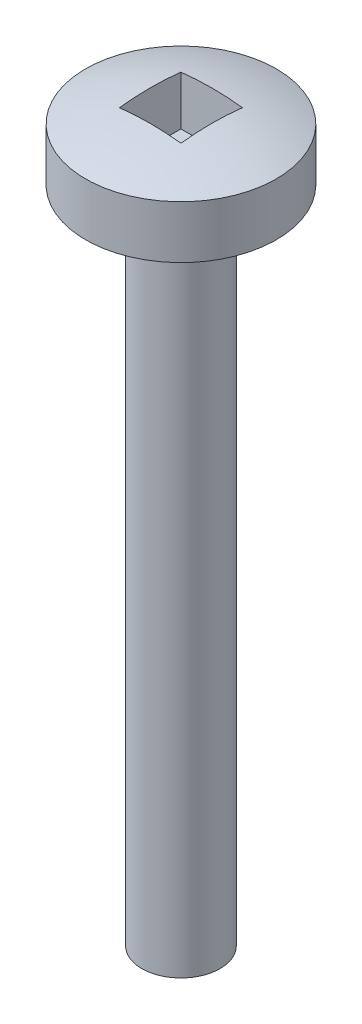
ISO-10303-21;
HEADER;
FILE_DESCRIPTION(('STEP AP214'),'2;1');
FILE_NAME('part.step','',(''),(''),'','','');
FILE_SCHEMA(('AUTOMOTIVE_DESIGN { 1 0 10303 214 1 1 1 1 }'));
ENDSEC;
DATA;
#1=APPLICATION_CONTEXT('core data for automotive mechanical design processes');
#2=APPLICATION_PROTOCOL_DEFINITION('international standard','automotive_design',2000,#1);
#3=PRODUCT_CONTEXT('',#1,'mechanical');
#4=PRODUCT('Part','Part','',(#3));
#5=PRODUCT_RELATED_PRODUCT_CATEGORY('part','',(#4));
#6=PRODUCT_DEFINITION_FORMATION('','',#4);
#7=PRODUCT_DEFINITION_CONTEXT('part definition',#1,'design');
#8=PRODUCT_DEFINITION('design','',#6,#7);
#9=PRODUCT_DEFINITION_SHAPE('','',#8);
#10=(LENGTH_UNIT() NAMED_UNIT(*) SI_UNIT(.MILLI.,.METRE.));
#11=(NAMED_UNIT(*) PLANE_ANGLE_UNIT() SI_UNIT($,.RADIAN.));
#12=(NAMED_UNIT(*) SI_UNIT($,.STERADIAN.) SOLID_ANGLE_UNIT());
#13=UNCERTAINTY_MEASURE_WITH_UNIT(LENGTH_MEASURE(1.E-05),#10,'distance_accuracy_value','');
#14=(GEOMETRIC_REPRESENTATION_CONTEXT(3) GLOBAL_UNCERTAINTY_ASSIGNED_CONTEXT((#13)) GLOBAL_UNIT_ASSIGNED_CONTEXT((#10,
#11,#12)) REPRESENTATION_CONTEXT('',''));
#15=CARTESIAN_POINT('',(0.,0.,0.));
#16=DIRECTION('',(0.,0.,1.));
#17=DIRECTION('',(1.,0.,0.));
#18=AXIS2_PLACEMENT_3D('',#15,#16,#17);
#19=CARTESIAN_POINT('',(0.,-19.05,0.));
#20=DIRECTION('',(0.,1.,0.));
#21=DIRECTION('',(0.,0.,1.));
#22=AXIS2_PLACEMENT_3D('',#19,#20,#21);
#23=CYLINDRICAL_SURFACE('',#22,1.1303);
#24=CARTESIAN_POINT('',(0.,-19.05,0.));
#25=DIRECTION('',(0.,1.,0.));
#26=DIRECTION('',(0.,0.,1.));
#27=AXIS2_PLACEMENT_3D('',#24,#25,#26);
#28=CIRCLE('',#27,1.1303);
#29=CARTESIAN_POINT('',(0.,-19.05,1.1303));
#30=VERTEX_POINT('',#29);
#31=EDGE_CURVE('E105',#30,#30,#28,.T.);
#32=CARTESIAN_POINT('',(0.,0.,0.));
#33=DIRECTION('',(0.,1.,0.));
#34=DIRECTION('',(0.,0.,1.));
#35=AXIS2_PLACEMENT_3D('',#32,#33,#34);
#36=CIRCLE('',#35,1.1303);
#37=CARTESIAN_POINT('',(0.,0.,1.1303));
#38=VERTEX_POINT('',#37);
#39=EDGE_CURVE('E109',#38,#38,#36,.T.);
#40=CARTESIAN_POINT('',(0.,-19.05,1.1303));
#41=CARTESIAN_POINT('',(0.,-18.8515625,1.1303));
#42=CARTESIAN_POINT('',(0.,-18.653125,1.1303));
#43=CARTESIAN_POINT('',(0.,-18.25625,1.1303));
#44=CARTESIAN_POINT('',(0.,-18.0578125,1.1303));
#45=CARTESIAN_POINT('',(0.,-17.6609375,1.1303));
#46=CARTESIAN_POINT('',(0.,-17.4625,1.1303));
#47=CARTESIAN_POINT('',(0.,-17.065625,1.1303));
#48=CARTESIAN_POINT('',(0.,-16.8671875,1.1303));
#49=CARTESIAN_POINT('',(0.,-16.4703125,1.1303));
#50=CARTESIAN_POINT('',(0.,-16.271875,1.1303));
#51=CARTESIAN_POINT('',(0.,-15.875,1.1303));
#52=CARTESIAN_POINT('',(0.,-15.6765625,1.1303));
#53=CARTESIAN_POINT('',(0.,-15.2796875,1.1303));
#54=CARTESIAN_POINT('',(0.,-15.08125,1.1303));
#55=CARTESIAN_POINT('',(0.,-14.684375,1.1303));
#56=CARTESIAN_POINT('',(0.,-14.4859375,1.1303));
#57=CARTESIAN_POINT('',(0.,-14.0890625,1.1303));
#58=CARTESIAN_POINT('',(0.,-13.890625,1.1303));
#59=CARTESIAN_POINT('',(0.,-13.49375,1.1303));
#60=CARTESIAN_POINT('',(0.,-13.2953125,1.1303));
#61=CARTESIAN_POINT('',(0.,-12.8984375,1.1303));
#62=CARTESIAN_POINT('',(0.,-12.7,1.1303));
#63=CARTESIAN_POINT('',(0.,-12.303125,1.1303));
#64=CARTESIAN_POINT('',(0.,-12.1046875,1.1303));
#65=CARTESIAN_POINT('',(0.,-11.7078125,1.1303));
#66=CARTESIAN_POINT('',(0.,-11.509375,1.1303));
#67=CARTESIAN_POINT('',(0.,-11.1125,1.1303));
#68=CARTESIAN_POINT('',(0.,-10.9140625,1.1303));
#69=CARTESIAN_POINT('',(0.,-10.5171875,1.1303));
#70=CARTESIAN_POINT('',(0.,-10.31875,1.1303));
#71=CARTESIAN_POINT('',(0.,-9.921875,1.1303));
#72=CARTESIAN_POINT('',(0.,-9.7234375,1.1303));
#73=CARTESIAN_POINT('',(0.,-9.3265625,1.1303));
#74=CARTESIAN_POINT('',(0.,-9.128125,1.1303));
#75=CARTESIAN_POINT('',(0.,-8.73125,1.1303));
#76=CARTESIAN_POINT('',(0.,-8.5328125,1.1303));
#77=CARTESIAN_POINT('',(0.,-8.1359375,1.1303));
#78=CARTESIAN_POINT('',(0.,-7.9375,1.1303));
#79=CARTESIAN_POINT('',(0.,-7.540625,1.1303));
#80=CARTESIAN_POINT('',(0.,-7.3421875,1.1303));
#81=CARTESIAN_POINT('',(0.,-6.9453125,1.1303));
#82=CARTESIAN_POINT('',(0.,-6.746875,1.1303));
#83=CARTESIAN_POINT('',(0.,-6.35,1.1303));
#84=CARTESIAN_POINT('',(0.,-6.1515625,1.1303));
#85=CARTESIAN_POINT('',(0.,-5.7546875,1.1303));
#86=CARTESIAN_POINT('',(0.,-5.55625,1.1303));
#87=CARTESIAN_POINT('',(0.,-5.159375,1.1303));
#88=CARTESIAN_POINT('',(0.,-4.9609375,1.1303));
#89=CARTESIAN_POINT('',(0.,-4.5640625,1.1303));
#90=CARTESIAN_POINT('',(0.,-4.365625,1.1303));
#91=CARTESIAN_POINT('',(0.,-3.96875,1.1303));
#92=CARTESIAN_POINT('',(0.,-3.7703125,1.1303));
#93=CARTESIAN_POINT('',(0.,-3.3734375,1.1303));
#94=CARTESIAN_POINT('',(0.,-3.175,1.1303));
#95=CARTESIAN_POINT('',(0.,-2.778125,1.1303));
#96=CARTESIAN_POINT('',(0.,-2.5796875,1.1303));
#97=CARTESIAN_POINT('',(0.,-2.1828125,1.1303));
#98=CARTESIAN_POINT('',(0.,-1.984375,1.1303));
#99=CARTESIAN_POINT('',(0.,-1.5875,1.1303));
#100=CARTESIAN_POINT('',(0.,-1.3890625,1.1303));
#101=CARTESIAN_POINT('',(0.,-0.992187500000001,1.1303));
#102=CARTESIAN_POINT('',(0.,-0.793750000000001,1.1303));
#103=CARTESIAN_POINT('',(0.,-0.396875,1.1303));
#104=CARTESIAN_POINT('',(0.,-0.1984375,1.1303));
#105=CARTESIAN_POINT('',(0.,0.,1.1303));
#106=B_SPLINE_CURVE_WITH_KNOTS('',3,(#40,#41,#42,#43,#44,#45,#46,#47,#48,#49,#50,#51,#52,#53,
#54,#55,#56,#57,#58,#59,#60,#61,#62,#63,#64,#65,#66,#67,#68,#69,#70,#71,#72,#73,#74,#75,#76,#77,
#78,#79,#80,#81,#82,#83,#84,#85,#86,#87,#88,#89,#90,#91,#92,#93,#94,#95,#96,#97,#98,#99,#100,
#101,#102,#103,#104,#105),.UNSPECIFIED.,.F.,.F.,(4,2,2,2,2,2,2,2,2,2,2,2,2,2,2,2,2,2,2,2,2,2,2,
2,2,2,2,2,2,2,2,2,4),(0.,0.5953125,1.190625,1.7859375,2.38125,2.9765625,3.571875,4.1671875,
4.7625,5.3578125,5.953125,6.5484375,7.14375,7.7390625,8.334375,8.9296875,9.525,10.1203125,
10.715625,11.3109375,11.90625,12.5015625,13.096875,13.6921875,14.2875,14.8828125,15.478125,
16.0734375,16.66875,17.2640625,17.859375,18.4546875,19.05),.UNSPECIFIED.);
#107=EDGE_CURVE('BSEAM33',#30,#38,#106,.T.);
#108=ORIENTED_EDGE('',*,*,#31,.T.);
#109=ORIENTED_EDGE('',*,*,#39,.F.);
#110=ORIENTED_EDGE('',*,*,#107,.T.);
#111=ORIENTED_EDGE('',*,*,#107,.F.);
#112=EDGE_LOOP('',(#108,#110,#109,#111));
#113=FACE_BOUND('',#112,.T.);
#114=ADVANCED_FACE('F33',(#113),#23,.T.);
#115=CARTESIAN_POINT('',(0.,-19.05,0.));
#116=DIRECTION('',(0.,1.,0.));
#117=DIRECTION('',(0.,0.,1.));
#118=AXIS2_PLACEMENT_3D('',#115,#116,#117);
#119=PLANE('',#118);
#120=ORIENTED_EDGE('',*,*,#31,.F.);
#121=EDGE_LOOP('',(#120));
#122=FACE_BOUND('',#121,.T.);
#123=ADVANCED_FACE('F129',(#122),#119,.F.);
#124=CARTESIAN_POINT('',(0.,1.524,0.));
#125=DIRECTION('',(0.,-1.,0.));
#126=DIRECTION('',(0.,0.,-1.));
#127=AXIS2_PLACEMENT_3D('',#124,#125,#126);
#128=CYLINDRICAL_SURFACE('',#127,2.7559);
#129=CARTESIAN_POINT('',(0.,1.524,0.));
#130=DIRECTION('',(0.,1.,0.));
#131=DIRECTION('',(0.,0.,1.));
#132=AXIS2_PLACEMENT_3D('',#129,#130,#131);
#133=CIRCLE('',#132,2.7559);
#134=CARTESIAN_POINT('',(0.,1.524,-2.7559));
#135=VERTEX_POINT('',#134);
#136=EDGE_CURVE('E104',#135,#135,#133,.T.);
#137=CARTESIAN_POINT('',(0.,0.,0.));
#138=DIRECTION('',(0.,1.,0.));
#139=DIRECTION('',(0.,0.,1.));
#140=AXIS2_PLACEMENT_3D('',#137,#138,#139);
#141=CIRCLE('',#140,2.7559);
#142=CARTESIAN_POINT('',(0.,0.,-2.7559));
#143=VERTEX_POINT('',#142);
#144=EDGE_CURVE('E98',#143,#143,#141,.T.);
#145=CARTESIAN_POINT('',(0.,1.524,-2.7559));
#146=CARTESIAN_POINT('',(0.,1.508125,-2.7559));
#147=CARTESIAN_POINT('',(0.,1.49225,-2.7559));
#148=CARTESIAN_POINT('',(0.,1.4605,-2.7559));
#149=CARTESIAN_POINT('',(0.,1.444625,-2.7559));
#150=CARTESIAN_POINT('',(0.,1.412875,-2.7559));
#151=CARTESIAN_POINT('',(0.,1.397,-2.7559));
#152=CARTESIAN_POINT('',(0.,1.36525,-2.7559));
#153=CARTESIAN_POINT('',(0.,1.349375,-2.7559));
#154=CARTESIAN_POINT('',(0.,1.317625,-2.7559));
#155=CARTESIAN_POINT('',(0.,1.30175,-2.7559));
#156=CARTESIAN_POINT('',(0.,1.27,-2.7559));
#157=CARTESIAN_POINT('',(0.,1.254125,-2.7559));
#158=CARTESIAN_POINT('',(0.,1.222375,-2.7559));
#159=CARTESIAN_POINT('',(0.,1.2065,-2.7559));
#160=CARTESIAN_POINT('',(0.,1.17475,-2.7559));
#161=CARTESIAN_POINT('',(0.,1.158875,-2.7559));
#162=CARTESIAN_POINT('',(0.,1.127125,-2.7559));
#163=CARTESIAN_POINT('',(0.,1.11125,-2.7559));
#164=CARTESIAN_POINT('',(0.,1.0795,-2.7559));
#165=CARTESIAN_POINT('',(0.,1.063625,-2.7559));
#166=CARTESIAN_POINT('',(0.,1.031875,-2.7559));
#167=CARTESIAN_POINT('',(0.,1.016,-2.7559));
#168=CARTESIAN_POINT('',(0.,0.98425,-2.7559));
#169=CARTESIAN_POINT('',(0.,0.968375,-2.7559));
#170=CARTESIAN_POINT('',(0.,0.936625,-2.7559));
#171=CARTESIAN_POINT('',(0.,0.92075,-2.7559));
#172=CARTESIAN_POINT('',(0.,0.889,-2.7559));
#173=CARTESIAN_POINT('',(0.,0.873125,-2.7559));
#174=CARTESIAN_POINT('',(0.,0.841375,-2.7559));
#175=CARTESIAN_POINT('',(0.,0.8255,-2.7559));
#176=CARTESIAN_POINT('',(0.,0.79375,-2.7559));
#177=CARTESIAN_POINT('',(0.,0.777875,-2.7559));
#178=CARTESIAN_POINT('',(0.,0.746125,-2.7559));
#179=CARTESIAN_POINT('',(0.,0.73025,-2.7559));
#180=CARTESIAN_POINT('',(0.,0.6985,-2.7559));
#181=CARTESIAN_POINT('',(0.,0.682625,-2.7559));
#182=CARTESIAN_POINT('',(0.,0.650875,-2.7559));
#183=CARTESIAN_POINT('',(0.,0.635,-2.7559));
#184=CARTESIAN_POINT('',(0.,0.60325,-2.7559));
#185=CARTESIAN_POINT('',(0.,0.587375,-2.7559));
#186=CARTESIAN_POINT('',(0.,0.555625,-2.7559));
#187=CARTESIAN_POINT('',(0.,0.53975,-2.7559));
#188=CARTESIAN_POINT('',(0.,0.508,-2.7559));
#189=CARTESIAN_POINT('',(0.,0.492125,-2.7559));
#190=CARTESIAN_POINT('',(0.,0.460375,-2.7559));
#191=CARTESIAN_POINT('',(0.,0.4445,-2.7559));
#192=CARTESIAN_POINT('',(0.,0.41275,-2.7559));
#193=CARTESIAN_POINT('',(0.,0.396875,-2.7559));
#194=CARTESIAN_POINT('',(0.,0.365125,-2.7559));
#195=CARTESIAN_POINT('',(0.,0.34925,-2.7559));
#196=CARTESIAN_POINT('',(0.,0.3175,-2.7559));
#197=CARTESIAN_POINT('',(0.,0.301625,-2.7559));
#198=CARTESIAN_POINT('',(0.,0.269875,-2.7559));
#199=CARTESIAN_POINT('',(0.,0.254,-2.7559));
#200=CARTESIAN_POINT('',(0.,0.22225,-2.7559));
#201=CARTESIAN_POINT('',(0.,0.206375,-2.7559));
#202=CARTESIAN_POINT('',(0.,0.174625,-2.7559));
#203=CARTESIAN_POINT('',(0.,0.15875,-2.7559));
#204=CARTESIAN_POINT('',(0.,0.127,-2.7559));
#205=CARTESIAN_POINT('',(0.,0.111125,-2.7559));
#206=CARTESIAN_POINT('',(0.,0.079375,-2.7559));
#207=CARTESIAN_POINT('',(0.,0.0635,-2.7559));
#208=CARTESIAN_POINT('',(0.,0.0317499999999999,-2.7559));
#209=CARTESIAN_POINT('',(0.,0.015875,-2.7559));
#210=CARTESIAN_POINT('',(0.,0.,-2.7559));
#211=B_SPLINE_CURVE_WITH_KNOTS('',3,(#145,#146,#147,#148,#149,#150,#151,#152,#153,#154,#155,
#156,#157,#158,#159,#160,#161,#162,#163,#164,#165,#166,#167,#168,#169,#170,#171,#172,#173,#174,
#175,#176,#177,#178,#179,#180,#181,#182,#183,#184,#185,#186,#187,#188,#189,#190,#191,#192,#193,
#194,#195,#196,#197,#198,#199,#200,#201,#202,#203,#204,#205,#206,#207,#208,#209,#210),
.UNSPECIFIED.,.F.,.F.,(4,2,2,2,2,2,2,2,2,2,2,2,2,2,2,2,2,2,2,2,2,2,2,2,2,2,2,2,2,2,2,2,4),(0.,
0.0476250000000001,0.0952500000000001,0.142875,0.1905,0.238125,0.28575,0.333375,0.381,0.428625,
0.47625,0.523875,0.5715,0.619125,0.66675,0.714375,0.762,0.809625,0.85725,0.904875,0.9525,
1.000125,1.04775,1.095375,1.143,1.190625,1.23825,1.285875,1.3335,1.381125,1.42875,1.476375,
1.524),.UNSPECIFIED.);
#212=EDGE_CURVE('BSEAM124',#135,#143,#211,.T.);
#213=ORIENTED_EDGE('',*,*,#136,.F.);
#214=ORIENTED_EDGE('',*,*,#144,.T.);
#215=ORIENTED_EDGE('',*,*,#212,.T.);
#216=ORIENTED_EDGE('',*,*,#212,.F.);
#217=EDGE_LOOP('',(#213,#215,#214,#216));
#218=FACE_BOUND('',#217,.T.);
#219=ADVANCED_FACE('F124',(#218),#128,.T.);
#220=CARTESIAN_POINT('',(0.,-5.69737875,0.));
#221=DIRECTION('',(0.,0.,1.));
#222=DIRECTION('',(1.,0.,0.));
#223=AXIS2_PLACEMENT_3D('',#220,#221,#222);
#224=SPHERICAL_SURFACE('',#223,7.72937875);
#225=CARTESIAN_POINT('',(0.889,-5.69737875,0.));
#226=DIRECTION('',(1.,0.,0.));
#227=DIRECTION('',(0.,0.,-1.));
#228=AXIS2_PLACEMENT_3D('',#225,#226,#227);
#229=CIRCLE('',#228,7.67808406185759);
#230=CARTESIAN_POINT('',(0.889,1.92906562867028,0.889));
#231=VERTEX_POINT('',#230);
#232=CARTESIAN_POINT('',(0.889,1.92906562867028,-0.889));
#233=VERTEX_POINT('',#232);
#234=EDGE_CURVE('E11',#231,#233,#229,.F.);
#235=ORIENTED_EDGE('',*,*,#234,.F.);
#236=CARTESIAN_POINT('',(0.,-5.69737875,0.889));
#237=DIRECTION('',(0.,0.,1.));
#238=DIRECTION('',(1.,0.,0.));
#239=AXIS2_PLACEMENT_3D('',#236,#237,#238);
#240=CIRCLE('',#239,7.67808406185759);
#241=CARTESIAN_POINT('',(-0.889,1.92906562867028,0.888999999999999));
#242=VERTEX_POINT('',#241);
#243=EDGE_CURVE('E41',#242,#231,#240,.F.);
#244=ORIENTED_EDGE('',*,*,#243,.F.);
#245=CARTESIAN_POINT('',(-0.889,-5.69737875,0.));
#246=DIRECTION('',(-1.,0.,0.));
#247=DIRECTION('',(0.,0.,1.));
#248=AXIS2_PLACEMENT_3D('',#245,#246,#247);
#249=CIRCLE('',#248,7.67808406185759);
#250=CARTESIAN_POINT('',(-0.888999999999999,1.92906562867028,-0.889));
#251=VERTEX_POINT('',#250);
#252=EDGE_CURVE('E115',#251,#242,#249,.F.);
#253=ORIENTED_EDGE('',*,*,#252,.F.);
#254=CARTESIAN_POINT('',(0.,-5.69737875,-0.889));
#255=DIRECTION('',(0.,0.,-1.));
#256=DIRECTION('',(-1.,0.,0.));
#257=AXIS2_PLACEMENT_3D('',#254,#255,#256);
#258=CIRCLE('',#257,7.67808406185759);
#259=EDGE_CURVE('E108',#233,#251,#258,.F.);
#260=ORIENTED_EDGE('',*,*,#259,.F.);
#261=EDGE_LOOP('',(#235,#244,#253,#260));
#262=FACE_BOUND('',#261,.T.);
#263=ORIENTED_EDGE('',*,*,#136,.T.);
#264=EDGE_LOOP('',(#263));
#265=FACE_BOUND('',#264,.T.);
#266=ADVANCED_FACE('F35',(#262,#265),#224,.T.);
#267=CARTESIAN_POINT('',(0.,0.,0.));
#268=DIRECTION('',(0.,1.,0.));
#269=DIRECTION('',(0.,0.,1.));
#270=AXIS2_PLACEMENT_3D('',#267,#268,#269);
#271=PLANE('',#270);
#272=ORIENTED_EDGE('',*,*,#39,.T.);
#273=EDGE_LOOP('',(#272));
#274=FACE_BOUND('',#273,.T.);
#275=ORIENTED_EDGE('',*,*,#144,.F.);
#276=EDGE_LOOP('',(#275));
#277=FACE_BOUND('',#276,.T.);
#278=ADVANCED_FACE('F123',(#274,#277),#271,.F.);
#279=CARTESIAN_POINT('',(0.889,0.508,0.889));
#280=DIRECTION('',(1.,0.,0.));
#281=DIRECTION('',(0.,0.,-1.));
#282=AXIS2_PLACEMENT_3D('',#279,#280,#281);
#283=PLANE('',#282);
#284=ORIENTED_EDGE('',*,*,#234,.T.);
#285=DIRECTION('',(0.,1.,0.));
#286=VECTOR('',#285,1.);
#287=CARTESIAN_POINT('',(0.889,0.508,-0.889));
#288=LINE('',#287,#286);
#289=CARTESIAN_POINT('',(0.889,0.508,-0.889));
#290=VERTEX_POINT('',#289);
#291=EDGE_CURVE('E48',#290,#233,#288,.T.);
#292=ORIENTED_EDGE('',*,*,#291,.F.);
#293=DIRECTION('',(0.,0.,-1.));
#294=VECTOR('',#293,1.);
#295=CARTESIAN_POINT('',(0.889,0.508,0.889));
#296=LINE('',#295,#294);
#297=CARTESIAN_POINT('',(0.889,0.508,0.889));
#298=VERTEX_POINT('',#297);
#299=EDGE_CURVE('E74',#298,#290,#296,.T.);
#300=ORIENTED_EDGE('',*,*,#299,.F.);
#301=DIRECTION('',(0.,1.,0.));
#302=VECTOR('',#301,1.);
#303=CARTESIAN_POINT('',(0.889,0.508,0.889));
#304=LINE('',#303,#302);
#305=EDGE_CURVE('E96',#298,#231,#304,.T.);
#306=ORIENTED_EDGE('',*,*,#305,.T.);
#307=EDGE_LOOP('',(#284,#292,#300,#306));
#308=FACE_BOUND('',#307,.T.);
#309=ADVANCED_FACE('F72',(#308),#283,.F.);
#310=CARTESIAN_POINT('',(-0.889,0.508,0.889));
#311=DIRECTION('',(0.,0.,1.));
#312=DIRECTION('',(1.,0.,0.));
#313=AXIS2_PLACEMENT_3D('',#310,#311,#312);
#314=PLANE('',#313);
#315=ORIENTED_EDGE('',*,*,#243,.T.);
#316=ORIENTED_EDGE('',*,*,#305,.F.);
#317=DIRECTION('',(1.,0.,0.));
#318=VECTOR('',#317,1.);
#319=CARTESIAN_POINT('',(-0.889,0.508,0.889));
#320=LINE('',#319,#318);
#321=CARTESIAN_POINT('',(-0.889,0.508,0.889));
#322=VERTEX_POINT('',#321);
#323=EDGE_CURVE('E79',#322,#298,#320,.T.);
#324=ORIENTED_EDGE('',*,*,#323,.F.);
#325=DIRECTION('',(0.,1.,0.));
#326=VECTOR('',#325,1.);
#327=CARTESIAN_POINT('',(-0.889,0.508,0.889));
#328=LINE('',#327,#326);
#329=EDGE_CURVE('E99',#322,#242,#328,.T.);
#330=ORIENTED_EDGE('',*,*,#329,.T.);
#331=EDGE_LOOP('',(#315,#316,#324,#330));
#332=FACE_BOUND('',#331,.T.);
#333=ADVANCED_FACE('F120',(#332),#314,.F.);
#334=CARTESIAN_POINT('',(-0.889,0.508,0.889));
#335=DIRECTION('',(-1.,0.,0.));
#336=DIRECTION('',(0.,0.,1.));
#337=AXIS2_PLACEMENT_3D('',#334,#335,#336);
#338=PLANE('',#337);
#339=ORIENTED_EDGE('',*,*,#252,.T.);
#340=ORIENTED_EDGE('',*,*,#329,.F.);
#341=DIRECTION('',(0.,0.,1.));
#342=VECTOR('',#341,1.);
#343=CARTESIAN_POINT('',(-0.889,0.508,0.889));
#344=LINE('',#343,#342);
#345=CARTESIAN_POINT('',(-0.889,0.508,-0.889));
#346=VERTEX_POINT('',#345);
#347=EDGE_CURVE('E88',#346,#322,#344,.T.);
#348=ORIENTED_EDGE('',*,*,#347,.F.);
#349=DIRECTION('',(0.,1.,0.));
#350=VECTOR('',#349,1.);
#351=CARTESIAN_POINT('',(-0.889,0.508,-0.889));
#352=LINE('',#351,#350);
#353=EDGE_CURVE('E78',#346,#251,#352,.T.);
#354=ORIENTED_EDGE('',*,*,#353,.T.);
#355=EDGE_LOOP('',(#339,#340,#348,#354));
#356=FACE_BOUND('',#355,.T.);
#357=ADVANCED_FACE('F118',(#356),#338,.F.);
#358=CARTESIAN_POINT('',(-0.889,0.508,-0.889));
#359=DIRECTION('',(0.,0.,-1.));
#360=DIRECTION('',(-1.,0.,0.));
#361=AXIS2_PLACEMENT_3D('',#358,#359,#360);
#362=PLANE('',#361);
#363=ORIENTED_EDGE('',*,*,#259,.T.);
#364=ORIENTED_EDGE('',*,*,#353,.F.);
#365=DIRECTION('',(-1.,0.,0.));
#366=VECTOR('',#365,1.);
#367=CARTESIAN_POINT('',(-0.889,0.508,-0.889));
#368=LINE('',#367,#366);
#369=EDGE_CURVE('E82',#290,#346,#368,.T.);
#370=ORIENTED_EDGE('',*,*,#369,.F.);
#371=ORIENTED_EDGE('',*,*,#291,.T.);
#372=EDGE_LOOP('',(#363,#364,#370,#371));
#373=FACE_BOUND('',#372,.T.);
#374=ADVANCED_FACE('F83',(#373),#362,.F.);
#375=CARTESIAN_POINT('',(0.,0.508,0.));
#376=DIRECTION('',(0.,-1.,0.));
#377=DIRECTION('',(0.,0.,-1.));
#378=AXIS2_PLACEMENT_3D('',#375,#376,#377);
#379=PLANE('',#378);
#380=ORIENTED_EDGE('',*,*,#299,.T.);
#381=ORIENTED_EDGE('',*,*,#369,.T.);
#382=ORIENTED_EDGE('',*,*,#347,.T.);
#383=ORIENTED_EDGE('',*,*,#323,.T.);
#384=EDGE_LOOP('',(#380,#381,#382,#383));
#385=FACE_BOUND('',#384,.T.);
#386=ADVANCED_FACE('F90',(#385),#379,.F.);
#387=CLOSED_SHELL('',(#114,#123,#219,#266,#278,#309,#333,#357,#374,#386));
#388=MANIFOLD_SOLID_BREP('B2',#387);
#389=ADVANCED_BREP_SHAPE_REPRESENTATION('',(#18,#388),#14);
#390=SHAPE_DEFINITION_REPRESENTATION(#9,#389);
ENDSEC;
END-ISO-10303-21;
